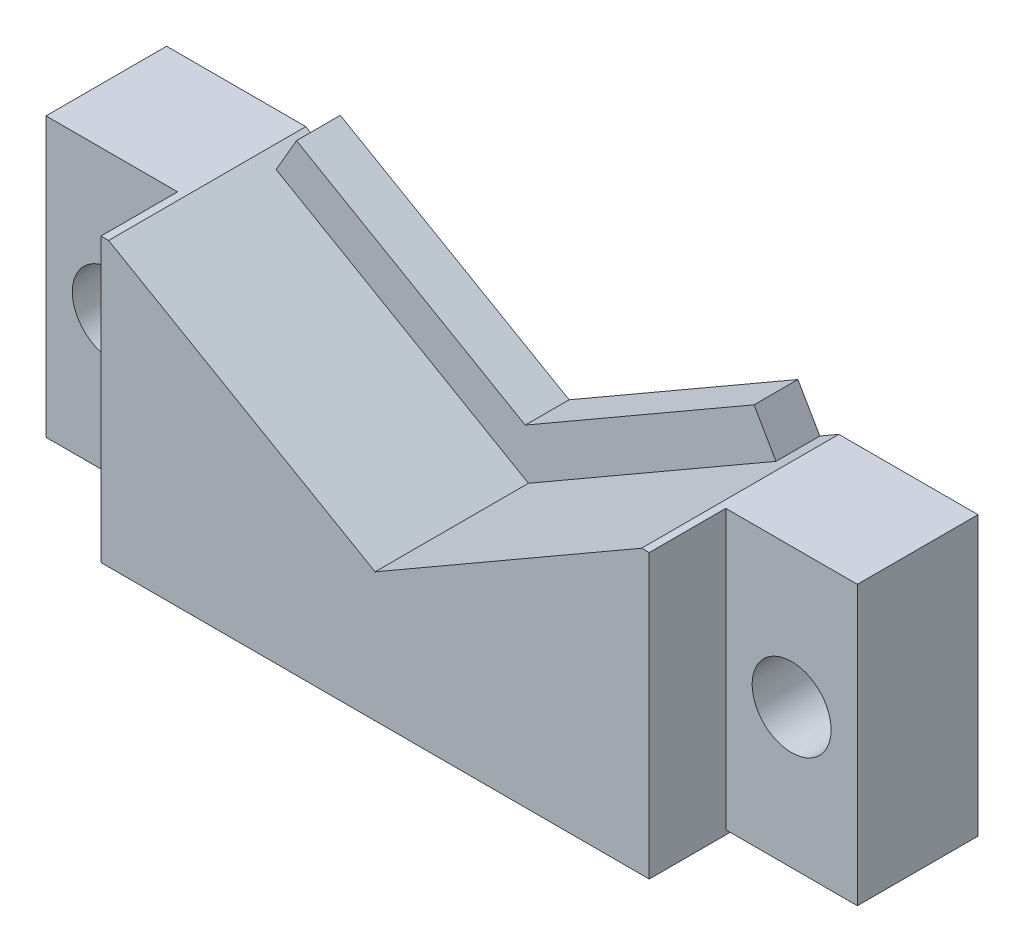
ISO-10303-21;
HEADER;
FILE_DESCRIPTION(('STEP AP214'),'2;1');
FILE_NAME('part.step','',(''),(''),'','','');
FILE_SCHEMA(('AUTOMOTIVE_DESIGN { 1 0 10303 214 1 1 1 1 }'));
ENDSEC;
DATA;
#1=APPLICATION_CONTEXT('core data for automotive mechanical design processes');
#2=APPLICATION_PROTOCOL_DEFINITION('international standard','automotive_design',2000,#1);
#3=PRODUCT_CONTEXT('',#1,'mechanical');
#4=PRODUCT('Part','Part','',(#3));
#5=PRODUCT_RELATED_PRODUCT_CATEGORY('part','',(#4));
#6=PRODUCT_DEFINITION_FORMATION('','',#4);
#7=PRODUCT_DEFINITION_CONTEXT('part definition',#1,'design');
#8=PRODUCT_DEFINITION('design','',#6,#7);
#9=PRODUCT_DEFINITION_SHAPE('','',#8);
#10=(LENGTH_UNIT() NAMED_UNIT(*) SI_UNIT(.MILLI.,.METRE.));
#11=(NAMED_UNIT(*) PLANE_ANGLE_UNIT() SI_UNIT($,.RADIAN.));
#12=(NAMED_UNIT(*) SI_UNIT($,.STERADIAN.) SOLID_ANGLE_UNIT());
#13=UNCERTAINTY_MEASURE_WITH_UNIT(LENGTH_MEASURE(1.E-05),#10,'distance_accuracy_value','');
#14=(GEOMETRIC_REPRESENTATION_CONTEXT(3) GLOBAL_UNCERTAINTY_ASSIGNED_CONTEXT((#13)) GLOBAL_UNIT_ASSIGNED_CONTEXT((#10,
#11,#12)) REPRESENTATION_CONTEXT('',''));
#15=CARTESIAN_POINT('',(0.,0.,0.));
#16=DIRECTION('',(0.,0.,1.));
#17=DIRECTION('',(1.,0.,0.));
#18=AXIS2_PLACEMENT_3D('',#15,#16,#17);
#19=CARTESIAN_POINT('',(12.5,77.2590300720005,17.7145589746358));
#20=DIRECTION('',(1.,0.,0.));
#21=DIRECTION('',(0.,0.,-1.));
#22=AXIS2_PLACEMENT_3D('',#19,#20,#21);
#23=PLANE('',#22);
#24=DIRECTION('',(0.,1.,0.));
#25=VECTOR('',#24,1.);
#26=CARTESIAN_POINT('',(12.5,77.4590300720005,-14.));
#27=LINE('',#26,#25);
#28=CARTESIAN_POINT('',(12.5,77.4590300720005,-14.));
#29=VERTEX_POINT('',#28);
#30=CARTESIAN_POINT('',(12.5,90.1531216351297,-14.));
#31=VERTEX_POINT('',#30);
#32=EDGE_CURVE('E201',#29,#31,#27,.T.);
#33=ORIENTED_EDGE('',*,*,#32,.T.);
#34=DIRECTION('',(0.,0.,1.));
#35=VECTOR('',#34,1.);
#36=CARTESIAN_POINT('',(12.5,90.1531216351297,17.7145589746358));
#37=LINE('',#36,#35);
#38=CARTESIAN_POINT('',(12.5,90.1531216351297,-10.5069794997921));
#39=VERTEX_POINT('',#38);
#40=EDGE_CURVE('E261',#31,#39,#37,.T.);
#41=ORIENTED_EDGE('',*,*,#40,.T.);
#42=DIRECTION('',(0.,1.,0.));
#43=VECTOR('',#42,1.);
#44=CARTESIAN_POINT('',(12.5,77.2590300720005,-10.5069794997921));
#45=LINE('',#44,#43);
#46=CARTESIAN_POINT('',(12.5,77.2590300720005,-10.5069794997921));
#47=VERTEX_POINT('',#46);
#48=EDGE_CURVE('E46',#47,#39,#45,.T.);
#49=ORIENTED_EDGE('',*,*,#48,.F.);
#50=DIRECTION('',(0.,0.,-1.));
#51=VECTOR('',#50,1.);
#52=CARTESIAN_POINT('',(12.5,77.2590300720005,17.7145589746358));
#53=LINE('',#52,#51);
#54=CARTESIAN_POINT('',(12.5,77.2590300720005,-19.5));
#55=VERTEX_POINT('',#54);
#56=EDGE_CURVE('E196',#47,#55,#53,.T.);
#57=ORIENTED_EDGE('',*,*,#56,.T.);
#58=DIRECTION('',(0.,-1.,0.));
#59=VECTOR('',#58,1.);
#60=CARTESIAN_POINT('',(12.5,77.4590300720005,-19.5));
#61=LINE('',#60,#59);
#62=CARTESIAN_POINT('',(12.5,77.4590300720005,-19.5));
#63=VERTEX_POINT('',#62);
#64=EDGE_CURVE('E271',#63,#55,#61,.T.);
#65=ORIENTED_EDGE('',*,*,#64,.F.);
#66=DIRECTION('',(0.,0.,-1.));
#67=VECTOR('',#66,1.);
#68=CARTESIAN_POINT('',(12.5,77.4590300720005,0.0406538527630007));
#69=LINE('',#68,#67);
#70=EDGE_CURVE('E239',#29,#63,#69,.T.);
#71=ORIENTED_EDGE('',*,*,#70,.F.);
#72=EDGE_LOOP('',(#33,#41,#49,#57,#65,#71));
#73=FACE_BOUND('',#72,.T.);
#74=ADVANCED_FACE('F38',(#73),#23,.T.);
#75=CARTESIAN_POINT('',(12.5,90.3531216351297,17.7145589746358));
#76=DIRECTION('',(-0.499609284060678,0.866250866250867,0.));
#77=DIRECTION('',(-0.866250866250867,-0.499609284060678,0.));
#78=AXIS2_PLACEMENT_3D('',#75,#76,#77);
#79=PLANE('',#78);
#80=DIRECTION('',(0.,0.,-1.));
#81=VECTOR('',#80,1.);
#82=CARTESIAN_POINT('',(11.2869778090811,89.6535123510691,-17.5));
#83=LINE('',#82,#81);
#84=CARTESIAN_POINT('',(11.2869778090811,89.6535123510691,-17.5));
#85=VERTEX_POINT('',#84);
#86=CARTESIAN_POINT('',(11.2869778090811,89.6535123510691,-19.5));
#87=VERTEX_POINT('',#86);
#88=EDGE_CURVE('E186',#85,#87,#83,.T.);
#89=ORIENTED_EDGE('',*,*,#88,.F.);
#90=DIRECTION('',(-0.866250866250867,-0.499609284060678,0.));
#91=VECTOR('',#90,1.);
#92=CARTESIAN_POINT('',(11.2869778090811,89.6535123510691,-17.5));
#93=LINE('',#92,#91);
#94=CARTESIAN_POINT('',(0.,83.1437596661342,-17.5));
#95=VERTEX_POINT('',#94);
#96=EDGE_CURVE('E171',#85,#95,#93,.T.);
#97=ORIENTED_EDGE('',*,*,#96,.T.);
#98=DIRECTION('',(0.,0.,-1.));
#99=VECTOR('',#98,1.);
#100=CARTESIAN_POINT('',(0.,83.1437596661342,17.7145589746358));
#101=LINE('',#100,#99);
#102=CARTESIAN_POINT('',(0.,83.1437596661342,-10.5069794997921));
#103=VERTEX_POINT('',#102);
#104=EDGE_CURVE('E184',#103,#95,#101,.T.);
#105=ORIENTED_EDGE('',*,*,#104,.F.);
#106=DIRECTION('',(-0.866250866250867,-0.499609284060678,0.));
#107=VECTOR('',#106,1.);
#108=CARTESIAN_POINT('',(12.5,90.3531216351297,-10.5069794997921));
#109=LINE('',#108,#107);
#110=CARTESIAN_POINT('',(12.153228675332,90.1531216351297,-10.5069794997921));
#111=VERTEX_POINT('',#110);
#112=EDGE_CURVE('E62',#111,#103,#109,.T.);
#113=ORIENTED_EDGE('',*,*,#112,.F.);
#114=DIRECTION('',(0.,0.,-1.));
#115=VECTOR('',#114,1.);
#116=CARTESIAN_POINT('',(12.153228675332,90.1531216351297,17.7145589746358));
#117=LINE('',#116,#115);
#118=CARTESIAN_POINT('',(12.153228675332,90.1531216351297,-19.5));
#119=VERTEX_POINT('',#118);
#120=EDGE_CURVE('E292',#111,#119,#117,.T.);
#121=ORIENTED_EDGE('',*,*,#120,.T.);
#122=DIRECTION('',(0.866250866250867,0.499609284060678,0.));
#123=VECTOR('',#122,1.);
#124=CARTESIAN_POINT('',(0.,83.1437596661342,-19.5));
#125=LINE('',#124,#123);
#126=EDGE_CURVE('E317',#87,#119,#125,.T.);
#127=ORIENTED_EDGE('',*,*,#126,.F.);
#128=EDGE_LOOP('',(#89,#97,#105,#113,#121,#127));
#129=FACE_BOUND('',#128,.T.);
#130=ADVANCED_FACE('F183',(#129),#79,.T.);
#131=CARTESIAN_POINT('',(0.,83.1437596661342,17.7145589746358));
#132=DIRECTION('',(0.499609284060679,0.866250866250866,0.));
#133=DIRECTION('',(-0.866250866250866,0.499609284060679,0.));
#134=AXIS2_PLACEMENT_3D('',#131,#132,#133);
#135=PLANE('',#134);
#136=DIRECTION('',(0.,0.,-1.));
#137=VECTOR('',#136,1.);
#138=CARTESIAN_POINT('',(-11.5054827283297,89.7795348354586,-17.5));
#139=LINE('',#138,#137);
#140=CARTESIAN_POINT('',(-11.5054827283297,89.7795348354586,-17.5));
#141=VERTEX_POINT('',#140);
#142=CARTESIAN_POINT('',(-11.5054827283297,89.7795348354586,-19.5));
#143=VERTEX_POINT('',#142);
#144=EDGE_CURVE('E295',#141,#143,#139,.T.);
#145=ORIENTED_EDGE('',*,*,#144,.T.);
#146=DIRECTION('',(0.866250866250866,-0.499609284060679,0.));
#147=VECTOR('',#146,1.);
#148=CARTESIAN_POINT('',(-12.5,90.3531216351298,-19.5));
#149=LINE('',#148,#147);
#150=CARTESIAN_POINT('',(-12.1532286753319,90.1531216351297,-19.5));
#151=VERTEX_POINT('',#150);
#152=EDGE_CURVE('E204',#151,#143,#149,.T.);
#153=ORIENTED_EDGE('',*,*,#152,.F.);
#154=DIRECTION('',(0.,0.,1.));
#155=VECTOR('',#154,1.);
#156=CARTESIAN_POINT('',(-12.1532286753319,90.1531216351297,17.7145589746358));
#157=LINE('',#156,#155);
#158=CARTESIAN_POINT('',(-12.1532286753319,90.1531216351297,-10.5069794997921));
#159=VERTEX_POINT('',#158);
#160=EDGE_CURVE('E290',#151,#159,#157,.T.);
#161=ORIENTED_EDGE('',*,*,#160,.T.);
#162=DIRECTION('',(-0.866250866250866,0.499609284060679,0.));
#163=VECTOR('',#162,1.);
#164=CARTESIAN_POINT('',(0.,83.1437596661342,-10.5069794997921));
#165=LINE('',#164,#163);
#166=EDGE_CURVE('E191',#103,#159,#165,.T.);
#167=ORIENTED_EDGE('',*,*,#166,.F.);
#168=ORIENTED_EDGE('',*,*,#104,.T.);
#169=DIRECTION('',(-0.866250866250866,0.499609284060679,0.));
#170=VECTOR('',#169,1.);
#171=CARTESIAN_POINT('',(0.,83.1437596661342,-17.5));
#172=LINE('',#171,#170);
#173=EDGE_CURVE('E167',#95,#141,#172,.T.);
#174=ORIENTED_EDGE('',*,*,#173,.T.);
#175=EDGE_LOOP('',(#145,#153,#161,#167,#168,#174));
#176=FACE_BOUND('',#175,.T.);
#177=ADVANCED_FACE('F189',(#176),#135,.T.);
#178=CARTESIAN_POINT('',(-12.5,77.2590300720005,17.7145589746358));
#179=DIRECTION('',(-1.,0.,0.));
#180=DIRECTION('',(0.,0.,1.));
#181=AXIS2_PLACEMENT_3D('',#178,#179,#180);
#182=PLANE('',#181);
#183=DIRECTION('',(0.,-1.,0.));
#184=VECTOR('',#183,1.);
#185=CARTESIAN_POINT('',(-12.5,77.2590300720005,-10.5069794997921));
#186=LINE('',#185,#184);
#187=CARTESIAN_POINT('',(-12.5,90.1531216351297,-10.5069794997921));
#188=VERTEX_POINT('',#187);
#189=CARTESIAN_POINT('',(-12.5,77.2590300720005,-10.5069794997921));
#190=VERTEX_POINT('',#189);
#191=EDGE_CURVE('E192',#188,#190,#186,.T.);
#192=ORIENTED_EDGE('',*,*,#191,.F.);
#193=DIRECTION('',(0.,0.,-1.));
#194=VECTOR('',#193,1.);
#195=CARTESIAN_POINT('',(-12.5,90.1531216351297,17.7145589746358));
#196=LINE('',#195,#194);
#197=CARTESIAN_POINT('',(-12.5,90.1531216351297,-14.));
#198=VERTEX_POINT('',#197);
#199=EDGE_CURVE('E293',#188,#198,#196,.T.);
#200=ORIENTED_EDGE('',*,*,#199,.T.);
#201=DIRECTION('',(0.,-1.,0.));
#202=VECTOR('',#201,1.);
#203=CARTESIAN_POINT('',(-12.5,90.1531216351297,-14.));
#204=LINE('',#203,#202);
#205=CARTESIAN_POINT('',(-12.5,77.4590300720005,-14.));
#206=VERTEX_POINT('',#205);
#207=EDGE_CURVE('E219',#198,#206,#204,.T.);
#208=ORIENTED_EDGE('',*,*,#207,.T.);
#209=DIRECTION('',(0.,0.,-1.));
#210=VECTOR('',#209,1.);
#211=CARTESIAN_POINT('',(-12.5,77.4590300720005,0.0406538527630007));
#212=LINE('',#211,#210);
#213=CARTESIAN_POINT('',(-12.5,77.4590300720005,-19.5));
#214=VERTEX_POINT('',#213);
#215=EDGE_CURVE('E222',#206,#214,#212,.T.);
#216=ORIENTED_EDGE('',*,*,#215,.T.);
#217=DIRECTION('',(0.,1.,0.));
#218=VECTOR('',#217,1.);
#219=CARTESIAN_POINT('',(-12.5,77.2590300720005,-19.5));
#220=LINE('',#219,#218);
#221=CARTESIAN_POINT('',(-12.5,77.2590300720005,-19.5));
#222=VERTEX_POINT('',#221);
#223=EDGE_CURVE('E270',#222,#214,#220,.T.);
#224=ORIENTED_EDGE('',*,*,#223,.F.);
#225=DIRECTION('',(0.,0.,-1.));
#226=VECTOR('',#225,1.);
#227=CARTESIAN_POINT('',(-12.5,77.2590300720005,17.7145589746358));
#228=LINE('',#227,#226);
#229=EDGE_CURVE('E193',#190,#222,#228,.T.);
#230=ORIENTED_EDGE('',*,*,#229,.F.);
#231=EDGE_LOOP('',(#192,#200,#208,#216,#224,#230));
#232=FACE_BOUND('',#231,.T.);
#233=ADVANCED_FACE('F388',(#232),#182,.T.);
#234=CARTESIAN_POINT('',(18.5,97.5468814646291,-10.5069794997921));
#235=DIRECTION('',(0.,0.,-1.));
#236=DIRECTION('',(0.,1.,0.));
#237=AXIS2_PLACEMENT_3D('',#234,#235,#236);
#238=PLANE('',#237);
#239=DIRECTION('',(1.,0.,0.));
#240=VECTOR('',#239,1.);
#241=CARTESIAN_POINT('',(-18.5,90.1531216351297,-10.5069794997921));
#242=LINE('',#241,#240);
#243=EDGE_CURVE('E291',#188,#159,#242,.T.);
#244=ORIENTED_EDGE('',*,*,#243,.F.);
#245=ORIENTED_EDGE('',*,*,#191,.T.);
#246=DIRECTION('',(1.,0.,0.));
#247=VECTOR('',#246,1.);
#248=CARTESIAN_POINT('',(12.5,77.2590300720005,-10.5069794997921));
#249=LINE('',#248,#247);
#250=EDGE_CURVE('E12',#190,#47,#249,.T.);
#251=ORIENTED_EDGE('',*,*,#250,.T.);
#252=ORIENTED_EDGE('',*,*,#48,.T.);
#253=EDGE_CURVE('E254',#111,#39,#242,.T.);
#254=ORIENTED_EDGE('',*,*,#253,.F.);
#255=ORIENTED_EDGE('',*,*,#112,.T.);
#256=ORIENTED_EDGE('',*,*,#166,.T.);
#257=EDGE_LOOP('',(#244,#245,#251,#252,#254,#255,#256));
#258=FACE_BOUND('',#257,.T.);
#259=ADVANCED_FACE('F253',(#258),#238,.F.);
#260=CARTESIAN_POINT('',(0.,0.,-19.5));
#261=DIRECTION('',(0.,0.,-1.));
#262=DIRECTION('',(-1.,0.,0.));
#263=AXIS2_PLACEMENT_3D('',#260,#261,#262);
#264=PLANE('',#263);
#265=DIRECTION('',(0.499609284060679,-0.866250866250866,0.));
#266=VECTOR('',#265,1.);
#267=CARTESIAN_POINT('',(11.2869778090811,89.6535123510691,-19.5));
#268=LINE('',#267,#266);
#269=CARTESIAN_POINT('',(10.2877592409597,91.3860140835708,-19.5));
#270=VERTEX_POINT('',#269);
#271=EDGE_CURVE('E187',#270,#87,#268,.T.);
#272=ORIENTED_EDGE('',*,*,#271,.T.);
#273=ORIENTED_EDGE('',*,*,#126,.T.);
#274=DIRECTION('',(1.,0.,0.));
#275=VECTOR('',#274,1.);
#276=CARTESIAN_POINT('',(12.5,90.1531216351297,-19.5));
#277=LINE('',#276,#275);
#278=CARTESIAN_POINT('',(18.5,90.1531216351297,-19.5));
#279=VERTEX_POINT('',#278);
#280=EDGE_CURVE('E319',#119,#279,#277,.T.);
#281=ORIENTED_EDGE('',*,*,#280,.T.);
#282=DIRECTION('',(0.,-1.,0.));
#283=VECTOR('',#282,1.);
#284=CARTESIAN_POINT('',(18.5,90.1531216351297,-19.5));
#285=LINE('',#284,#283);
#286=CARTESIAN_POINT('',(18.5,77.4590300720005,-19.5));
#287=VERTEX_POINT('',#286);
#288=EDGE_CURVE('E322',#279,#287,#285,.T.);
#289=ORIENTED_EDGE('',*,*,#288,.T.);
#290=DIRECTION('',(-1.,0.,0.));
#291=VECTOR('',#290,1.);
#292=CARTESIAN_POINT('',(18.5,77.4590300720005,-19.5));
#293=LINE('',#292,#291);
#294=EDGE_CURVE('E275',#287,#63,#293,.T.);
#295=ORIENTED_EDGE('',*,*,#294,.T.);
#296=ORIENTED_EDGE('',*,*,#64,.T.);
#297=DIRECTION('',(-1.,0.,0.));
#298=VECTOR('',#297,1.);
#299=CARTESIAN_POINT('',(12.5,77.2590300720005,-19.5));
#300=LINE('',#299,#298);
#301=EDGE_CURVE('E266',#55,#222,#300,.T.);
#302=ORIENTED_EDGE('',*,*,#301,.T.);
#303=ORIENTED_EDGE('',*,*,#223,.T.);
#304=DIRECTION('',(-1.,0.,0.));
#305=VECTOR('',#304,1.);
#306=CARTESIAN_POINT('',(-12.5,77.4590300720005,-19.5));
#307=LINE('',#306,#305);
#308=CARTESIAN_POINT('',(-18.5,77.4590300720005,-19.5));
#309=VERTEX_POINT('',#308);
#310=EDGE_CURVE('E273',#214,#309,#307,.T.);
#311=ORIENTED_EDGE('',*,*,#310,.T.);
#312=DIRECTION('',(0.,1.,0.));
#313=VECTOR('',#312,1.);
#314=CARTESIAN_POINT('',(-18.5,77.4590300720005,-19.5));
#315=LINE('',#314,#313);
#316=CARTESIAN_POINT('',(-18.5,90.1531216351297,-19.5));
#317=VERTEX_POINT('',#316);
#318=EDGE_CURVE('E212',#309,#317,#315,.T.);
#319=ORIENTED_EDGE('',*,*,#318,.T.);
#320=DIRECTION('',(1.,0.,0.));
#321=VECTOR('',#320,1.);
#322=CARTESIAN_POINT('',(-18.5,90.1531216351297,-19.5));
#323=LINE('',#322,#321);
#324=EDGE_CURVE('E54',#317,#151,#323,.T.);
#325=ORIENTED_EDGE('',*,*,#324,.T.);
#326=ORIENTED_EDGE('',*,*,#152,.T.);
#327=DIRECTION('',(0.49960928406068,0.866250866250865,0.));
#328=VECTOR('',#327,1.);
#329=CARTESIAN_POINT('',(-10.578947496704,91.3860140835708,-19.5));
#330=LINE('',#329,#328);
#331=CARTESIAN_POINT('',(-10.578947496704,91.3860140835708,-19.5));
#332=VERTEX_POINT('',#331);
#333=EDGE_CURVE('E360',#143,#332,#330,.T.);
#334=ORIENTED_EDGE('',*,*,#333,.T.);
#335=DIRECTION('',(0.866250866250866,-0.499609284060678,0.));
#336=VECTOR('',#335,1.);
#337=CARTESIAN_POINT('',(-0.145594127872147,85.3685884046629,-19.5));
#338=LINE('',#337,#336);
#339=CARTESIAN_POINT('',(-0.145594127872147,85.3685884046629,-19.5));
#340=VERTEX_POINT('',#339);
#341=EDGE_CURVE('E345',#332,#340,#338,.T.);
#342=ORIENTED_EDGE('',*,*,#341,.T.);
#343=DIRECTION('',(0.866250866250866,0.499609284060678,0.));
#344=VECTOR('',#343,1.);
#345=CARTESIAN_POINT('',(10.2877592409597,91.3860140835708,-19.5));
#346=LINE('',#345,#344);
#347=EDGE_CURVE('E342',#340,#270,#346,.T.);
#348=ORIENTED_EDGE('',*,*,#347,.T.);
#349=EDGE_LOOP('',(#272,#273,#281,#289,#295,#296,#302,#303,#311,#319,#325,#326,#334,#342,#348));
#350=FACE_BOUND('',#349,.T.);
#351=CARTESIAN_POINT('',(-15.5,83.8060758535651,-19.5));
#352=DIRECTION('',(0.,0.,-1.));
#353=DIRECTION('',(-1.,0.,0.));
#354=AXIS2_PLACEMENT_3D('',#351,#352,#353);
#355=CIRCLE('',#354,1.8);
#356=CARTESIAN_POINT('',(-17.3,83.8060758535651,-19.5));
#357=VERTEX_POINT('',#356);
#358=EDGE_CURVE('E314',#357,#357,#355,.T.);
#359=ORIENTED_EDGE('',*,*,#358,.F.);
#360=EDGE_LOOP('',(#359));
#361=FACE_BOUND('',#360,.T.);
#362=CARTESIAN_POINT('',(15.5,83.8060758535651,-19.5));
#363=DIRECTION('',(0.,0.,-1.));
#364=DIRECTION('',(-1.,0.,0.));
#365=AXIS2_PLACEMENT_3D('',#362,#363,#364);
#366=CIRCLE('',#365,1.79999999999999);
#367=CARTESIAN_POINT('',(13.7,83.8060758535651,-19.5));
#368=VERTEX_POINT('',#367);
#369=EDGE_CURVE('E311',#368,#368,#366,.T.);
#370=ORIENTED_EDGE('',*,*,#369,.F.);
#371=EDGE_LOOP('',(#370));
#372=FACE_BOUND('',#371,.T.);
#373=ADVANCED_FACE('F282',(#350,#361,#372),#264,.T.);
#374=CARTESIAN_POINT('',(12.5,77.2590300720005,17.7145589746358));
#375=DIRECTION('',(0.,-1.,0.));
#376=DIRECTION('',(0.,0.,-1.));
#377=AXIS2_PLACEMENT_3D('',#374,#375,#376);
#378=PLANE('',#377);
#379=ORIENTED_EDGE('',*,*,#250,.F.);
#380=ORIENTED_EDGE('',*,*,#229,.T.);
#381=ORIENTED_EDGE('',*,*,#301,.F.);
#382=ORIENTED_EDGE('',*,*,#56,.F.);
#383=EDGE_LOOP('',(#379,#380,#381,#382));
#384=FACE_BOUND('',#383,.T.);
#385=ADVANCED_FACE('F264',(#384),#378,.T.);
#386=CARTESIAN_POINT('',(0.,0.,-14.));
#387=DIRECTION('',(0.,0.,1.));
#388=DIRECTION('',(1.,0.,0.));
#389=AXIS2_PLACEMENT_3D('',#386,#387,#388);
#390=PLANE('',#389);
#391=CARTESIAN_POINT('',(15.5,83.8060758535651,-14.));
#392=DIRECTION('',(0.,0.,1.));
#393=DIRECTION('',(1.,0.,0.));
#394=AXIS2_PLACEMENT_3D('',#391,#392,#393);
#395=CIRCLE('',#394,1.79999999999999);
#396=CARTESIAN_POINT('',(17.3,83.8060758535651,-14.));
#397=VERTEX_POINT('',#396);
#398=EDGE_CURVE('E41',#397,#397,#395,.T.);
#399=ORIENTED_EDGE('',*,*,#398,.F.);
#400=EDGE_LOOP('',(#399));
#401=FACE_BOUND('',#400,.T.);
#402=ORIENTED_EDGE('',*,*,#32,.F.);
#403=DIRECTION('',(-1.,0.,0.));
#404=VECTOR('',#403,1.);
#405=CARTESIAN_POINT('',(12.5,77.4590300720005,-14.));
#406=LINE('',#405,#404);
#407=CARTESIAN_POINT('',(18.5,77.4590300720005,-14.));
#408=VERTEX_POINT('',#407);
#409=EDGE_CURVE('E240',#408,#29,#406,.T.);
#410=ORIENTED_EDGE('',*,*,#409,.F.);
#411=DIRECTION('',(0.,-1.,0.));
#412=VECTOR('',#411,1.);
#413=CARTESIAN_POINT('',(18.5,77.4590300720005,-14.));
#414=LINE('',#413,#412);
#415=CARTESIAN_POINT('',(18.5,90.1531216351297,-14.));
#416=VERTEX_POINT('',#415);
#417=EDGE_CURVE('E244',#416,#408,#414,.T.);
#418=ORIENTED_EDGE('',*,*,#417,.F.);
#419=DIRECTION('',(1.,0.,0.));
#420=VECTOR('',#419,1.);
#421=CARTESIAN_POINT('',(12.5,90.1531216351297,-14.));
#422=LINE('',#421,#420);
#423=EDGE_CURVE('E233',#31,#416,#422,.T.);
#424=ORIENTED_EDGE('',*,*,#423,.F.);
#425=EDGE_LOOP('',(#402,#410,#418,#424));
#426=FACE_BOUND('',#425,.T.);
#427=ADVANCED_FACE('F332',(#401,#426),#390,.T.);
#428=CARTESIAN_POINT('',(12.5,90.1531216351297,0.0406538527630007));
#429=DIRECTION('',(0.,1.,0.));
#430=DIRECTION('',(0.,0.,1.));
#431=AXIS2_PLACEMENT_3D('',#428,#429,#430);
#432=PLANE('',#431);
#433=ORIENTED_EDGE('',*,*,#280,.F.);
#434=ORIENTED_EDGE('',*,*,#120,.F.);
#435=ORIENTED_EDGE('',*,*,#253,.T.);
#436=ORIENTED_EDGE('',*,*,#40,.F.);
#437=ORIENTED_EDGE('',*,*,#423,.T.);
#438=DIRECTION('',(0.,0.,-1.));
#439=VECTOR('',#438,1.);
#440=CARTESIAN_POINT('',(18.5,90.1531216351297,0.0406538527630007));
#441=LINE('',#440,#439);
#442=EDGE_CURVE('E236',#416,#279,#441,.T.);
#443=ORIENTED_EDGE('',*,*,#442,.T.);
#444=EDGE_LOOP('',(#433,#434,#435,#436,#437,#443));
#445=FACE_BOUND('',#444,.T.);
#446=ADVANCED_FACE('F337',(#445),#432,.T.);
#447=CARTESIAN_POINT('',(18.5,77.4590300720005,0.0406538527630007));
#448=DIRECTION('',(1.,0.,0.));
#449=DIRECTION('',(0.,0.,-1.));
#450=AXIS2_PLACEMENT_3D('',#447,#448,#449);
#451=PLANE('',#450);
#452=ORIENTED_EDGE('',*,*,#442,.F.);
#453=ORIENTED_EDGE('',*,*,#417,.T.);
#454=DIRECTION('',(0.,0.,-1.));
#455=VECTOR('',#454,1.);
#456=CARTESIAN_POINT('',(18.5,77.4590300720005,0.0406538527630007));
#457=LINE('',#456,#455);
#458=EDGE_CURVE('E243',#408,#287,#457,.T.);
#459=ORIENTED_EDGE('',*,*,#458,.T.);
#460=ORIENTED_EDGE('',*,*,#288,.F.);
#461=EDGE_LOOP('',(#452,#453,#459,#460));
#462=FACE_BOUND('',#461,.T.);
#463=ADVANCED_FACE('F426',(#462),#451,.T.);
#464=CARTESIAN_POINT('',(12.5,77.4590300720005,0.0406538527630007));
#465=DIRECTION('',(0.,-1.,0.));
#466=DIRECTION('',(0.,0.,-1.));
#467=AXIS2_PLACEMENT_3D('',#464,#465,#466);
#468=PLANE('',#467);
#469=ORIENTED_EDGE('',*,*,#458,.F.);
#470=ORIENTED_EDGE('',*,*,#409,.T.);
#471=ORIENTED_EDGE('',*,*,#70,.T.);
#472=ORIENTED_EDGE('',*,*,#294,.F.);
#473=EDGE_LOOP('',(#469,#470,#471,#472));
#474=FACE_BOUND('',#473,.T.);
#475=ADVANCED_FACE('F330',(#474),#468,.T.);
#476=CARTESIAN_POINT('',(0.,0.,-14.));
#477=DIRECTION('',(0.,0.,1.));
#478=DIRECTION('',(1.,0.,0.));
#479=AXIS2_PLACEMENT_3D('',#476,#477,#478);
#480=PLANE('',#479);
#481=CARTESIAN_POINT('',(-15.5,83.8060758535651,-14.));
#482=DIRECTION('',(0.,0.,1.));
#483=DIRECTION('',(1.,0.,0.));
#484=AXIS2_PLACEMENT_3D('',#481,#482,#483);
#485=CIRCLE('',#484,1.8);
#486=CARTESIAN_POINT('',(-13.7,83.8060758535651,-14.));
#487=VERTEX_POINT('',#486);
#488=EDGE_CURVE('E202',#487,#487,#485,.T.);
#489=ORIENTED_EDGE('',*,*,#488,.F.);
#490=EDGE_LOOP('',(#489));
#491=FACE_BOUND('',#490,.T.);
#492=ORIENTED_EDGE('',*,*,#207,.F.);
#493=DIRECTION('',(1.,0.,0.));
#494=VECTOR('',#493,1.);
#495=CARTESIAN_POINT('',(-12.5,90.1531216351297,-14.));
#496=LINE('',#495,#494);
#497=CARTESIAN_POINT('',(-18.5,90.1531216351297,-14.));
#498=VERTEX_POINT('',#497);
#499=EDGE_CURVE('E223',#498,#198,#496,.T.);
#500=ORIENTED_EDGE('',*,*,#499,.F.);
#501=DIRECTION('',(0.,1.,0.));
#502=VECTOR('',#501,1.);
#503=CARTESIAN_POINT('',(-18.5,90.1531216351297,-14.));
#504=LINE('',#503,#502);
#505=CARTESIAN_POINT('',(-18.5,77.4590300720005,-14.));
#506=VERTEX_POINT('',#505);
#507=EDGE_CURVE('E227',#506,#498,#504,.T.);
#508=ORIENTED_EDGE('',*,*,#507,.F.);
#509=DIRECTION('',(-1.,0.,0.));
#510=VECTOR('',#509,1.);
#511=CARTESIAN_POINT('',(-12.5,77.4590300720005,-14.));
#512=LINE('',#511,#510);
#513=EDGE_CURVE('E208',#206,#506,#512,.T.);
#514=ORIENTED_EDGE('',*,*,#513,.F.);
#515=EDGE_LOOP('',(#492,#500,#508,#514));
#516=FACE_BOUND('',#515,.T.);
#517=ADVANCED_FACE('F419',(#491,#516),#480,.T.);
#518=CARTESIAN_POINT('',(-12.5,77.4590300720005,0.0406538527630007));
#519=DIRECTION('',(0.,-1.,0.));
#520=DIRECTION('',(0.,0.,-1.));
#521=AXIS2_PLACEMENT_3D('',#518,#519,#520);
#522=PLANE('',#521);
#523=ORIENTED_EDGE('',*,*,#215,.F.);
#524=ORIENTED_EDGE('',*,*,#513,.T.);
#525=DIRECTION('',(0.,0.,-1.));
#526=VECTOR('',#525,1.);
#527=CARTESIAN_POINT('',(-18.5,77.4590300720005,0.0406538527630007));
#528=LINE('',#527,#526);
#529=EDGE_CURVE('E218',#506,#309,#528,.T.);
#530=ORIENTED_EDGE('',*,*,#529,.T.);
#531=ORIENTED_EDGE('',*,*,#310,.F.);
#532=EDGE_LOOP('',(#523,#524,#530,#531));
#533=FACE_BOUND('',#532,.T.);
#534=ADVANCED_FACE('F416',(#533),#522,.T.);
#535=CARTESIAN_POINT('',(-18.5,90.1531216351297,0.0406538527630007));
#536=DIRECTION('',(-1.,0.,0.));
#537=DIRECTION('',(0.,0.,1.));
#538=AXIS2_PLACEMENT_3D('',#535,#536,#537);
#539=PLANE('',#538);
#540=ORIENTED_EDGE('',*,*,#529,.F.);
#541=ORIENTED_EDGE('',*,*,#507,.T.);
#542=DIRECTION('',(0.,0.,-1.));
#543=VECTOR('',#542,1.);
#544=CARTESIAN_POINT('',(-18.5,90.1531216351297,0.0406538527630007));
#545=LINE('',#544,#543);
#546=EDGE_CURVE('E226',#498,#317,#545,.T.);
#547=ORIENTED_EDGE('',*,*,#546,.T.);
#548=ORIENTED_EDGE('',*,*,#318,.F.);
#549=EDGE_LOOP('',(#540,#541,#547,#548));
#550=FACE_BOUND('',#549,.T.);
#551=ADVANCED_FACE('F413',(#550),#539,.T.);
#552=CARTESIAN_POINT('',(-12.5,90.1531216351297,0.0406538527630007));
#553=DIRECTION('',(0.,1.,0.));
#554=DIRECTION('',(0.,0.,1.));
#555=AXIS2_PLACEMENT_3D('',#552,#553,#554);
#556=PLANE('',#555);
#557=ORIENTED_EDGE('',*,*,#546,.F.);
#558=ORIENTED_EDGE('',*,*,#499,.T.);
#559=ORIENTED_EDGE('',*,*,#199,.F.);
#560=ORIENTED_EDGE('',*,*,#243,.T.);
#561=ORIENTED_EDGE('',*,*,#160,.F.);
#562=ORIENTED_EDGE('',*,*,#324,.F.);
#563=EDGE_LOOP('',(#557,#558,#559,#560,#561,#562));
#564=FACE_BOUND('',#563,.T.);
#565=ADVANCED_FACE('F289',(#564),#556,.T.);
#566=CARTESIAN_POINT('',(-15.5,83.8060758535651,-5.41581067524895));
#567=DIRECTION('',(0.,0.,-1.));
#568=DIRECTION('',(-1.,0.,0.));
#569=AXIS2_PLACEMENT_3D('',#566,#567,#568);
#570=CYLINDRICAL_SURFACE('',#569,1.8);
#571=ORIENTED_EDGE('',*,*,#488,.T.);
#572=EDGE_LOOP('',(#571));
#573=FACE_BOUND('',#572,.T.);
#574=ORIENTED_EDGE('',*,*,#358,.T.);
#575=EDGE_LOOP('',(#574));
#576=FACE_BOUND('',#575,.T.);
#577=ADVANCED_FACE('F375',(#573,#576),#570,.F.);
#578=CARTESIAN_POINT('',(15.5,83.8060758535651,-5.41581067524895));
#579=DIRECTION('',(0.,0.,-1.));
#580=DIRECTION('',(-1.,0.,0.));
#581=AXIS2_PLACEMENT_3D('',#578,#579,#580);
#582=CYLINDRICAL_SURFACE('',#581,1.79999999999999);
#583=ORIENTED_EDGE('',*,*,#398,.T.);
#584=EDGE_LOOP('',(#583));
#585=FACE_BOUND('',#584,.T.);
#586=ORIENTED_EDGE('',*,*,#369,.T.);
#587=EDGE_LOOP('',(#586));
#588=FACE_BOUND('',#587,.T.);
#589=ADVANCED_FACE('F368',(#585,#588),#582,.F.);
#590=CARTESIAN_POINT('',(11.2869778090811,89.6535123510691,-17.5));
#591=DIRECTION('',(0.866250866250866,0.499609284060679,0.));
#592=DIRECTION('',(-0.499609284060679,0.866250866250866,0.));
#593=AXIS2_PLACEMENT_3D('',#590,#591,#592);
#594=PLANE('',#593);
#595=ORIENTED_EDGE('',*,*,#271,.F.);
#596=DIRECTION('',(0.,0.,-1.));
#597=VECTOR('',#596,1.);
#598=CARTESIAN_POINT('',(10.2877592409597,91.3860140835708,-17.5));
#599=LINE('',#598,#597);
#600=CARTESIAN_POINT('',(10.2877592409597,91.3860140835708,-17.5));
#601=VERTEX_POINT('',#600);
#602=EDGE_CURVE('E350',#601,#270,#599,.T.);
#603=ORIENTED_EDGE('',*,*,#602,.F.);
#604=DIRECTION('',(0.499609284060679,-0.866250866250866,0.));
#605=VECTOR('',#604,1.);
#606=CARTESIAN_POINT('',(11.2869778090811,89.6535123510691,-17.5));
#607=LINE('',#606,#605);
#608=EDGE_CURVE('E298',#601,#85,#607,.T.);
#609=ORIENTED_EDGE('',*,*,#608,.T.);
#610=ORIENTED_EDGE('',*,*,#88,.T.);
#611=EDGE_LOOP('',(#595,#603,#609,#610));
#612=FACE_BOUND('',#611,.T.);
#613=ADVANCED_FACE('F366',(#612),#594,.T.);
#614=CARTESIAN_POINT('',(10.2877592409597,91.3860140835708,-17.5));
#615=DIRECTION('',(-0.499609284060678,0.866250866250866,0.));
#616=DIRECTION('',(-0.866250866250866,-0.499609284060678,0.));
#617=AXIS2_PLACEMENT_3D('',#614,#615,#616);
#618=PLANE('',#617);
#619=ORIENTED_EDGE('',*,*,#347,.F.);
#620=DIRECTION('',(0.,0.,-1.));
#621=VECTOR('',#620,1.);
#622=CARTESIAN_POINT('',(-0.145594127872147,85.3685884046629,-17.5));
#623=LINE('',#622,#621);
#624=CARTESIAN_POINT('',(-0.145594127872147,85.3685884046629,-17.5));
#625=VERTEX_POINT('',#624);
#626=EDGE_CURVE('E300',#625,#340,#623,.T.);
#627=ORIENTED_EDGE('',*,*,#626,.F.);
#628=DIRECTION('',(0.866250866250866,0.499609284060678,0.));
#629=VECTOR('',#628,1.);
#630=CARTESIAN_POINT('',(10.2877592409597,91.3860140835708,-17.5));
#631=LINE('',#630,#629);
#632=EDGE_CURVE('E302',#625,#601,#631,.T.);
#633=ORIENTED_EDGE('',*,*,#632,.T.);
#634=ORIENTED_EDGE('',*,*,#602,.T.);
#635=EDGE_LOOP('',(#619,#627,#633,#634));
#636=FACE_BOUND('',#635,.T.);
#637=ADVANCED_FACE('F359',(#636),#618,.T.);
#638=CARTESIAN_POINT('',(-0.145594127872147,85.3685884046629,-17.5));
#639=DIRECTION('',(0.499609284060678,0.866250866250866,0.));
#640=DIRECTION('',(-0.866250866250867,0.499609284060678,0.));
#641=AXIS2_PLACEMENT_3D('',#638,#639,#640);
#642=PLANE('',#641);
#643=ORIENTED_EDGE('',*,*,#341,.F.);
#644=DIRECTION('',(0.,0.,-1.));
#645=VECTOR('',#644,1.);
#646=CARTESIAN_POINT('',(-10.578947496704,91.3860140835708,-17.5));
#647=LINE('',#646,#645);
#648=CARTESIAN_POINT('',(-10.578947496704,91.3860140835708,-17.5));
#649=VERTEX_POINT('',#648);
#650=EDGE_CURVE('E297',#649,#332,#647,.T.);
#651=ORIENTED_EDGE('',*,*,#650,.F.);
#652=DIRECTION('',(0.866250866250866,-0.499609284060678,0.));
#653=VECTOR('',#652,1.);
#654=CARTESIAN_POINT('',(-0.145594127872147,85.3685884046629,-17.5));
#655=LINE('',#654,#653);
#656=EDGE_CURVE('E355',#649,#625,#655,.T.);
#657=ORIENTED_EDGE('',*,*,#656,.T.);
#658=ORIENTED_EDGE('',*,*,#626,.T.);
#659=EDGE_LOOP('',(#643,#651,#657,#658));
#660=FACE_BOUND('',#659,.T.);
#661=ADVANCED_FACE('F354',(#660),#642,.T.);
#662=CARTESIAN_POINT('',(-10.578947496704,91.3860140835708,-17.5));
#663=DIRECTION('',(-0.866250866250865,0.499609284060681,0.));
#664=DIRECTION('',(-0.499609284060681,-0.866250866250865,0.));
#665=AXIS2_PLACEMENT_3D('',#662,#663,#664);
#666=PLANE('',#665);
#667=ORIENTED_EDGE('',*,*,#333,.F.);
#668=ORIENTED_EDGE('',*,*,#144,.F.);
#669=DIRECTION('',(0.49960928406068,0.866250866250865,0.));
#670=VECTOR('',#669,1.);
#671=CARTESIAN_POINT('',(-10.578947496704,91.3860140835708,-17.5));
#672=LINE('',#671,#670);
#673=EDGE_CURVE('E175',#141,#649,#672,.T.);
#674=ORIENTED_EDGE('',*,*,#673,.T.);
#675=ORIENTED_EDGE('',*,*,#650,.T.);
#676=EDGE_LOOP('',(#667,#668,#674,#675));
#677=FACE_BOUND('',#676,.T.);
#678=ADVANCED_FACE('F365',(#677),#666,.T.);
#679=CARTESIAN_POINT('',(0.,0.,-17.5));
#680=DIRECTION('',(0.,0.,-1.));
#681=DIRECTION('',(-1.,0.,0.));
#682=AXIS2_PLACEMENT_3D('',#679,#680,#681);
#683=PLANE('',#682);
#684=ORIENTED_EDGE('',*,*,#96,.F.);
#685=ORIENTED_EDGE('',*,*,#608,.F.);
#686=ORIENTED_EDGE('',*,*,#632,.F.);
#687=ORIENTED_EDGE('',*,*,#656,.F.);
#688=ORIENTED_EDGE('',*,*,#673,.F.);
#689=ORIENTED_EDGE('',*,*,#173,.F.);
#690=EDGE_LOOP('',(#684,#685,#686,#687,#688,#689));
#691=FACE_BOUND('',#690,.T.);
#692=ADVANCED_FACE('F169',(#691),#683,.F.);
#693=CLOSED_SHELL('',(#74,#130,#177,#233,#259,#373,#385,#427,#446,#463,#475,#517,#534,#551,#565,
#577,#589,#613,#637,#661,#678,#692));
#694=MANIFOLD_SOLID_BREP('B2',#693);
#695=ADVANCED_BREP_SHAPE_REPRESENTATION('',(#18,#694),#14);
#696=SHAPE_DEFINITION_REPRESENTATION(#9,#695);
ENDSEC;
END-ISO-10303-21;
